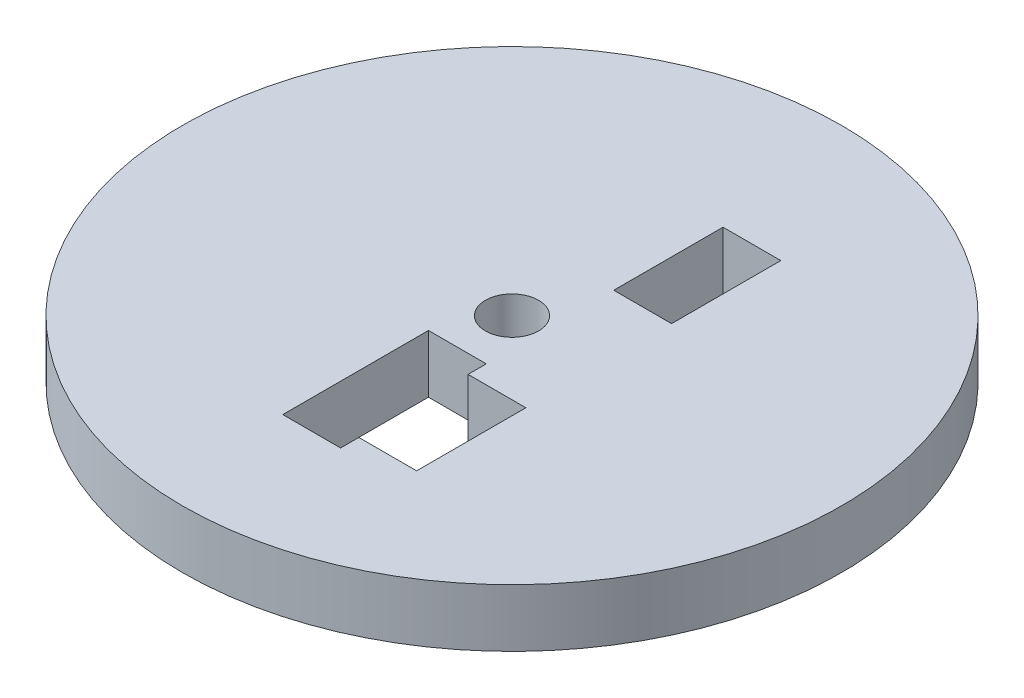
ISO-10303-21;
HEADER;
FILE_DESCRIPTION(('STEP AP214'),'2;1');
FILE_NAME('part.step','',(''),(''),'','','');
FILE_SCHEMA(('AUTOMOTIVE_DESIGN { 1 0 10303 214 1 1 1 1 }'));
ENDSEC;
DATA;
#1=APPLICATION_CONTEXT('core data for automotive mechanical design processes');
#2=APPLICATION_PROTOCOL_DEFINITION('international standard','automotive_design',2000,#1);
#3=PRODUCT_CONTEXT('',#1,'mechanical');
#4=PRODUCT('Part','Part','',(#3));
#5=PRODUCT_RELATED_PRODUCT_CATEGORY('part','',(#4));
#6=PRODUCT_DEFINITION_FORMATION('','',#4);
#7=PRODUCT_DEFINITION_CONTEXT('part definition',#1,'design');
#8=PRODUCT_DEFINITION('design','',#6,#7);
#9=PRODUCT_DEFINITION_SHAPE('','',#8);
#10=(LENGTH_UNIT() NAMED_UNIT(*) SI_UNIT(.MILLI.,.METRE.));
#11=(NAMED_UNIT(*) PLANE_ANGLE_UNIT() SI_UNIT($,.RADIAN.));
#12=(NAMED_UNIT(*) SI_UNIT($,.STERADIAN.) SOLID_ANGLE_UNIT());
#13=UNCERTAINTY_MEASURE_WITH_UNIT(LENGTH_MEASURE(1.E-05),#10,'distance_accuracy_value','');
#14=(GEOMETRIC_REPRESENTATION_CONTEXT(3) GLOBAL_UNCERTAINTY_ASSIGNED_CONTEXT((#13)) GLOBAL_UNIT_ASSIGNED_CONTEXT((#10,
#11,#12)) REPRESENTATION_CONTEXT('',''));
#15=CARTESIAN_POINT('',(0.,0.,0.));
#16=DIRECTION('',(0.,0.,1.));
#17=DIRECTION('',(1.,0.,0.));
#18=AXIS2_PLACEMENT_3D('',#15,#16,#17);
#19=CARTESIAN_POINT('',(0.,3.175,0.));
#20=DIRECTION('',(0.,1.,0.));
#21=DIRECTION('',(0.,0.,1.));
#22=AXIS2_PLACEMENT_3D('',#19,#20,#21);
#23=PLANE('',#22);
#24=DIRECTION('',(1.,0.,0.));
#25=VECTOR('',#24,1.);
#26=CARTESIAN_POINT('',(1.5875,3.175,-4.));
#27=LINE('',#26,#25);
#28=CARTESIAN_POINT('',(1.5875,3.175,-4.));
#29=VERTEX_POINT('',#28);
#30=CARTESIAN_POINT('',(4.7625,3.175,-4.));
#31=VERTEX_POINT('',#30);
#32=EDGE_CURVE('E199',#29,#31,#27,.T.);
#33=ORIENTED_EDGE('',*,*,#32,.F.);
#34=DIRECTION('',(0.,0.,1.));
#35=VECTOR('',#34,1.);
#36=CARTESIAN_POINT('',(1.5875,3.175,-4.));
#37=LINE('',#36,#35);
#38=CARTESIAN_POINT('',(1.5875,3.175,-10.));
#39=VERTEX_POINT('',#38);
#40=EDGE_CURVE('E197',#39,#29,#37,.T.);
#41=ORIENTED_EDGE('',*,*,#40,.F.);
#42=DIRECTION('',(-1.,0.,0.));
#43=VECTOR('',#42,1.);
#44=CARTESIAN_POINT('',(1.5875,3.175,-10.));
#45=LINE('',#44,#43);
#46=CARTESIAN_POINT('',(4.7625,3.175,-10.));
#47=VERTEX_POINT('',#46);
#48=EDGE_CURVE('E205',#47,#39,#45,.T.);
#49=ORIENTED_EDGE('',*,*,#48,.F.);
#50=DIRECTION('',(0.,0.,-1.));
#51=VECTOR('',#50,1.);
#52=CARTESIAN_POINT('',(4.7625,3.175,-4.));
#53=LINE('',#52,#51);
#54=EDGE_CURVE('E202',#31,#47,#53,.T.);
#55=ORIENTED_EDGE('',*,*,#54,.F.);
#56=EDGE_LOOP('',(#33,#41,#49,#55));
#57=FACE_BOUND('',#56,.T.);
#58=CARTESIAN_POINT('',(0.,3.175,0.));
#59=DIRECTION('',(0.,1.,0.));
#60=DIRECTION('',(0.,0.,1.));
#61=AXIS2_PLACEMENT_3D('',#58,#59,#60);
#62=CIRCLE('',#61,18.0975);
#63=CARTESIAN_POINT('',(0.,3.175,18.0975));
#64=VERTEX_POINT('',#63);
#65=EDGE_CURVE('E11',#64,#64,#62,.T.);
#66=ORIENTED_EDGE('',*,*,#65,.T.);
#67=EDGE_LOOP('',(#66));
#68=FACE_BOUND('',#67,.T.);
#69=CARTESIAN_POINT('',(0.,3.175,0.));
#70=DIRECTION('',(0.,1.,0.));
#71=DIRECTION('',(0.,0.,1.));
#72=AXIS2_PLACEMENT_3D('',#69,#70,#71);
#73=CIRCLE('',#72,1.4605);
#74=CARTESIAN_POINT('',(0.,3.175,1.4605));
#75=VERTEX_POINT('',#74);
#76=EDGE_CURVE('E191',#75,#75,#73,.T.);
#77=ORIENTED_EDGE('',*,*,#76,.F.);
#78=EDGE_LOOP('',(#77));
#79=FACE_BOUND('',#78,.T.);
#80=DIRECTION('',(0.,0.,-1.));
#81=VECTOR('',#80,1.);
#82=CARTESIAN_POINT('',(1.5875,3.175,4.));
#83=LINE('',#82,#81);
#84=CARTESIAN_POINT('',(1.5875,3.175,4.));
#85=VERTEX_POINT('',#84);
#86=CARTESIAN_POINT('',(1.5875,3.175,3.));
#87=VERTEX_POINT('',#86);
#88=EDGE_CURVE('E134',#85,#87,#83,.T.);
#89=ORIENTED_EDGE('',*,*,#88,.F.);
#90=DIRECTION('',(-1.,0.,0.));
#91=VECTOR('',#90,1.);
#92=CARTESIAN_POINT('',(1.5875,3.175,4.));
#93=LINE('',#92,#91);
#94=CARTESIAN_POINT('',(4.7625,3.175,4.));
#95=VERTEX_POINT('',#94);
#96=EDGE_CURVE('E126',#95,#85,#93,.T.);
#97=ORIENTED_EDGE('',*,*,#96,.F.);
#98=DIRECTION('',(0.,0.,-1.));
#99=VECTOR('',#98,1.);
#100=CARTESIAN_POINT('',(4.7625,3.175,4.));
#101=LINE('',#100,#99);
#102=CARTESIAN_POINT('',(4.7625,3.175,10.));
#103=VERTEX_POINT('',#102);
#104=EDGE_CURVE('E159',#103,#95,#101,.T.);
#105=ORIENTED_EDGE('',*,*,#104,.F.);
#106=DIRECTION('',(1.,0.,0.));
#107=VECTOR('',#106,1.);
#108=CARTESIAN_POINT('',(1.5875,3.175,10.));
#109=LINE('',#108,#107);
#110=CARTESIAN_POINT('',(1.5875,3.175,10.));
#111=VERTEX_POINT('',#110);
#112=EDGE_CURVE('E157',#111,#103,#109,.T.);
#113=ORIENTED_EDGE('',*,*,#112,.F.);
#114=DIRECTION('',(0.,0.,-1.));
#115=VECTOR('',#114,1.);
#116=CARTESIAN_POINT('',(1.5875,3.175,11.));
#117=LINE('',#116,#115);
#118=CARTESIAN_POINT('',(1.5875,3.175,11.));
#119=VERTEX_POINT('',#118);
#120=EDGE_CURVE('E155',#119,#111,#117,.T.);
#121=ORIENTED_EDGE('',*,*,#120,.F.);
#122=DIRECTION('',(1.,0.,0.));
#123=VECTOR('',#122,1.);
#124=CARTESIAN_POINT('',(-1.5875,3.175,11.));
#125=LINE('',#124,#123);
#126=CARTESIAN_POINT('',(-1.5875,3.175,11.));
#127=VERTEX_POINT('',#126);
#128=EDGE_CURVE('E153',#127,#119,#125,.T.);
#129=ORIENTED_EDGE('',*,*,#128,.F.);
#130=DIRECTION('',(0.,0.,1.));
#131=VECTOR('',#130,1.);
#132=CARTESIAN_POINT('',(-1.5875,3.175,3.));
#133=LINE('',#132,#131);
#134=CARTESIAN_POINT('',(-1.5875,3.175,3.));
#135=VERTEX_POINT('',#134);
#136=EDGE_CURVE('E149',#135,#127,#133,.T.);
#137=ORIENTED_EDGE('',*,*,#136,.F.);
#138=DIRECTION('',(-1.,0.,0.));
#139=VECTOR('',#138,1.);
#140=CARTESIAN_POINT('',(-1.5875,3.175,3.));
#141=LINE('',#140,#139);
#142=EDGE_CURVE('E147',#87,#135,#141,.T.);
#143=ORIENTED_EDGE('',*,*,#142,.F.);
#144=EDGE_LOOP('',(#89,#97,#105,#113,#121,#129,#137,#143));
#145=FACE_BOUND('',#144,.T.);
#146=ADVANCED_FACE('F37',(#57,#68,#79,#145),#23,.T.);
#147=CARTESIAN_POINT('',(0.,0.,0.));
#148=DIRECTION('',(0.,1.,0.));
#149=DIRECTION('',(0.,0.,1.));
#150=AXIS2_PLACEMENT_3D('',#147,#148,#149);
#151=PLANE('',#150);
#152=CARTESIAN_POINT('',(0.,0.,0.));
#153=DIRECTION('',(0.,1.,0.));
#154=DIRECTION('',(0.,0.,1.));
#155=AXIS2_PLACEMENT_3D('',#152,#153,#154);
#156=CIRCLE('',#155,1.4605);
#157=CARTESIAN_POINT('',(0.,0.,1.4605));
#158=VERTEX_POINT('',#157);
#159=EDGE_CURVE('E142',#158,#158,#156,.T.);
#160=ORIENTED_EDGE('',*,*,#159,.T.);
#161=EDGE_LOOP('',(#160));
#162=FACE_BOUND('',#161,.T.);
#163=DIRECTION('',(0.,0.,1.));
#164=VECTOR('',#163,1.);
#165=CARTESIAN_POINT('',(1.5875,0.,-4.));
#166=LINE('',#165,#164);
#167=CARTESIAN_POINT('',(1.5875,0.,-10.));
#168=VERTEX_POINT('',#167);
#169=CARTESIAN_POINT('',(1.5875,0.,-4.));
#170=VERTEX_POINT('',#169);
#171=EDGE_CURVE('E194',#168,#170,#166,.T.);
#172=ORIENTED_EDGE('',*,*,#171,.T.);
#173=DIRECTION('',(1.,0.,0.));
#174=VECTOR('',#173,1.);
#175=CARTESIAN_POINT('',(1.5875,0.,-4.));
#176=LINE('',#175,#174);
#177=CARTESIAN_POINT('',(4.7625,0.,-4.));
#178=VERTEX_POINT('',#177);
#179=EDGE_CURVE('E210',#170,#178,#176,.T.);
#180=ORIENTED_EDGE('',*,*,#179,.T.);
#181=DIRECTION('',(0.,0.,-1.));
#182=VECTOR('',#181,1.);
#183=CARTESIAN_POINT('',(4.7625,0.,-4.));
#184=LINE('',#183,#182);
#185=CARTESIAN_POINT('',(4.7625,0.,-10.));
#186=VERTEX_POINT('',#185);
#187=EDGE_CURVE('E213',#178,#186,#184,.T.);
#188=ORIENTED_EDGE('',*,*,#187,.T.);
#189=DIRECTION('',(-1.,0.,0.));
#190=VECTOR('',#189,1.);
#191=CARTESIAN_POINT('',(1.5875,0.,-10.));
#192=LINE('',#191,#190);
#193=EDGE_CURVE('E200',#186,#168,#192,.T.);
#194=ORIENTED_EDGE('',*,*,#193,.T.);
#195=EDGE_LOOP('',(#172,#180,#188,#194));
#196=FACE_BOUND('',#195,.T.);
#197=CARTESIAN_POINT('',(0.,0.,0.));
#198=DIRECTION('',(0.,1.,0.));
#199=DIRECTION('',(0.,0.,1.));
#200=AXIS2_PLACEMENT_3D('',#197,#198,#199);
#201=CIRCLE('',#200,18.0975);
#202=CARTESIAN_POINT('',(0.,0.,18.0975));
#203=VERTEX_POINT('',#202);
#204=EDGE_CURVE('E41',#203,#203,#201,.T.);
#205=ORIENTED_EDGE('',*,*,#204,.F.);
#206=EDGE_LOOP('',(#205));
#207=FACE_BOUND('',#206,.T.);
#208=DIRECTION('',(-1.,0.,0.));
#209=VECTOR('',#208,1.);
#210=CARTESIAN_POINT('',(1.5875,0.,4.));
#211=LINE('',#210,#209);
#212=CARTESIAN_POINT('',(4.7625,0.,4.));
#213=VERTEX_POINT('',#212);
#214=CARTESIAN_POINT('',(1.5875,0.,4.));
#215=VERTEX_POINT('',#214);
#216=EDGE_CURVE('E60',#213,#215,#211,.T.);
#217=ORIENTED_EDGE('',*,*,#216,.T.);
#218=DIRECTION('',(0.,0.,-1.));
#219=VECTOR('',#218,1.);
#220=CARTESIAN_POINT('',(1.5875,0.,4.));
#221=LINE('',#220,#219);
#222=CARTESIAN_POINT('',(1.5875,0.,3.));
#223=VERTEX_POINT('',#222);
#224=EDGE_CURVE('E141',#215,#223,#221,.T.);
#225=ORIENTED_EDGE('',*,*,#224,.T.);
#226=DIRECTION('',(-1.,0.,0.));
#227=VECTOR('',#226,1.);
#228=CARTESIAN_POINT('',(-1.5875,0.,3.));
#229=LINE('',#228,#227);
#230=CARTESIAN_POINT('',(-1.5875,0.,3.));
#231=VERTEX_POINT('',#230);
#232=EDGE_CURVE('E163',#223,#231,#229,.T.);
#233=ORIENTED_EDGE('',*,*,#232,.T.);
#234=DIRECTION('',(0.,0.,1.));
#235=VECTOR('',#234,1.);
#236=CARTESIAN_POINT('',(-1.5875,0.,3.));
#237=LINE('',#236,#235);
#238=CARTESIAN_POINT('',(-1.5875,0.,11.));
#239=VERTEX_POINT('',#238);
#240=EDGE_CURVE('E166',#231,#239,#237,.T.);
#241=ORIENTED_EDGE('',*,*,#240,.T.);
#242=DIRECTION('',(1.,0.,0.));
#243=VECTOR('',#242,1.);
#244=CARTESIAN_POINT('',(-1.5875,0.,11.));
#245=LINE('',#244,#243);
#246=CARTESIAN_POINT('',(1.5875,0.,11.));
#247=VERTEX_POINT('',#246);
#248=EDGE_CURVE('E169',#239,#247,#245,.T.);
#249=ORIENTED_EDGE('',*,*,#248,.T.);
#250=DIRECTION('',(0.,0.,-1.));
#251=VECTOR('',#250,1.);
#252=CARTESIAN_POINT('',(1.5875,0.,11.));
#253=LINE('',#252,#251);
#254=CARTESIAN_POINT('',(1.5875,0.,10.));
#255=VERTEX_POINT('',#254);
#256=EDGE_CURVE('E172',#247,#255,#253,.T.);
#257=ORIENTED_EDGE('',*,*,#256,.T.);
#258=DIRECTION('',(1.,0.,0.));
#259=VECTOR('',#258,1.);
#260=CARTESIAN_POINT('',(1.5875,0.,10.));
#261=LINE('',#260,#259);
#262=CARTESIAN_POINT('',(4.7625,0.,10.));
#263=VERTEX_POINT('',#262);
#264=EDGE_CURVE('E175',#255,#263,#261,.T.);
#265=ORIENTED_EDGE('',*,*,#264,.T.);
#266=DIRECTION('',(0.,0.,-1.));
#267=VECTOR('',#266,1.);
#268=CARTESIAN_POINT('',(4.7625,0.,4.));
#269=LINE('',#268,#267);
#270=EDGE_CURVE('E135',#263,#213,#269,.T.);
#271=ORIENTED_EDGE('',*,*,#270,.T.);
#272=EDGE_LOOP('',(#217,#225,#233,#241,#249,#257,#265,#271));
#273=FACE_BOUND('',#272,.T.);
#274=ADVANCED_FACE('F232',(#162,#196,#207,#273),#151,.F.);
#275=CARTESIAN_POINT('',(0.,3.175,0.));
#276=DIRECTION('',(0.,-1.,0.));
#277=DIRECTION('',(0.,0.,-1.));
#278=AXIS2_PLACEMENT_3D('',#275,#276,#277);
#279=CYLINDRICAL_SURFACE('',#278,18.0975);
#280=ORIENTED_EDGE('',*,*,#65,.F.);
#281=EDGE_LOOP('',(#280));
#282=FACE_BOUND('',#281,.T.);
#283=ORIENTED_EDGE('',*,*,#204,.T.);
#284=EDGE_LOOP('',(#283));
#285=FACE_BOUND('',#284,.T.);
#286=ADVANCED_FACE('F39',(#282,#285),#279,.T.);
#287=CARTESIAN_POINT('',(1.5875,3.175,-4.));
#288=DIRECTION('',(1.,0.,0.));
#289=DIRECTION('',(0.,0.,-1.));
#290=AXIS2_PLACEMENT_3D('',#287,#288,#289);
#291=PLANE('',#290);
#292=ORIENTED_EDGE('',*,*,#171,.F.);
#293=DIRECTION('',(0.,-1.,0.));
#294=VECTOR('',#293,1.);
#295=CARTESIAN_POINT('',(1.5875,3.175,-10.));
#296=LINE('',#295,#294);
#297=EDGE_CURVE('E207',#39,#168,#296,.T.);
#298=ORIENTED_EDGE('',*,*,#297,.F.);
#299=ORIENTED_EDGE('',*,*,#40,.T.);
#300=DIRECTION('',(0.,-1.,0.));
#301=VECTOR('',#300,1.);
#302=CARTESIAN_POINT('',(1.5875,3.175,-4.));
#303=LINE('',#302,#301);
#304=EDGE_CURVE('E224',#29,#170,#303,.T.);
#305=ORIENTED_EDGE('',*,*,#304,.T.);
#306=EDGE_LOOP('',(#292,#298,#299,#305));
#307=FACE_BOUND('',#306,.T.);
#308=ADVANCED_FACE('F275',(#307),#291,.T.);
#309=CARTESIAN_POINT('',(1.5875,3.175,-4.));
#310=DIRECTION('',(0.,0.,-1.));
#311=DIRECTION('',(-1.,0.,0.));
#312=AXIS2_PLACEMENT_3D('',#309,#310,#311);
#313=PLANE('',#312);
#314=ORIENTED_EDGE('',*,*,#179,.F.);
#315=ORIENTED_EDGE('',*,*,#304,.F.);
#316=ORIENTED_EDGE('',*,*,#32,.T.);
#317=DIRECTION('',(0.,-1.,0.));
#318=VECTOR('',#317,1.);
#319=CARTESIAN_POINT('',(4.7625,3.175,-4.));
#320=LINE('',#319,#318);
#321=EDGE_CURVE('E222',#31,#178,#320,.T.);
#322=ORIENTED_EDGE('',*,*,#321,.T.);
#323=EDGE_LOOP('',(#314,#315,#316,#322));
#324=FACE_BOUND('',#323,.T.);
#325=ADVANCED_FACE('F278',(#324),#313,.T.);
#326=CARTESIAN_POINT('',(4.7625,3.175,-4.));
#327=DIRECTION('',(-1.,0.,0.));
#328=DIRECTION('',(0.,0.,1.));
#329=AXIS2_PLACEMENT_3D('',#326,#327,#328);
#330=PLANE('',#329);
#331=ORIENTED_EDGE('',*,*,#187,.F.);
#332=ORIENTED_EDGE('',*,*,#321,.F.);
#333=ORIENTED_EDGE('',*,*,#54,.T.);
#334=DIRECTION('',(0.,-1.,0.));
#335=VECTOR('',#334,1.);
#336=CARTESIAN_POINT('',(4.7625,3.175,-10.));
#337=LINE('',#336,#335);
#338=EDGE_CURVE('E220',#47,#186,#337,.T.);
#339=ORIENTED_EDGE('',*,*,#338,.T.);
#340=EDGE_LOOP('',(#331,#332,#333,#339));
#341=FACE_BOUND('',#340,.T.);
#342=ADVANCED_FACE('F281',(#341),#330,.T.);
#343=CARTESIAN_POINT('',(1.5875,3.175,-10.));
#344=DIRECTION('',(0.,0.,1.));
#345=DIRECTION('',(1.,0.,0.));
#346=AXIS2_PLACEMENT_3D('',#343,#344,#345);
#347=PLANE('',#346);
#348=ORIENTED_EDGE('',*,*,#193,.F.);
#349=ORIENTED_EDGE('',*,*,#338,.F.);
#350=ORIENTED_EDGE('',*,*,#48,.T.);
#351=ORIENTED_EDGE('',*,*,#297,.T.);
#352=EDGE_LOOP('',(#348,#349,#350,#351));
#353=FACE_BOUND('',#352,.T.);
#354=ADVANCED_FACE('F285',(#353),#347,.T.);
#355=CARTESIAN_POINT('',(0.,3.175,0.));
#356=DIRECTION('',(0.,-1.,0.));
#357=DIRECTION('',(0.,0.,-1.));
#358=AXIS2_PLACEMENT_3D('',#355,#356,#357);
#359=CYLINDRICAL_SURFACE('',#358,1.4605);
#360=ORIENTED_EDGE('',*,*,#76,.T.);
#361=EDGE_LOOP('',(#360));
#362=FACE_BOUND('',#361,.T.);
#363=ORIENTED_EDGE('',*,*,#159,.F.);
#364=EDGE_LOOP('',(#363));
#365=FACE_BOUND('',#364,.T.);
#366=ADVANCED_FACE('F289',(#362,#365),#359,.F.);
#367=CARTESIAN_POINT('',(1.5875,3.175,4.));
#368=DIRECTION('',(0.,0.,1.));
#369=DIRECTION('',(1.,0.,0.));
#370=AXIS2_PLACEMENT_3D('',#367,#368,#369);
#371=PLANE('',#370);
#372=ORIENTED_EDGE('',*,*,#216,.F.);
#373=DIRECTION('',(0.,-1.,0.));
#374=VECTOR('',#373,1.);
#375=CARTESIAN_POINT('',(4.7625,3.175,4.));
#376=LINE('',#375,#374);
#377=EDGE_CURVE('E130',#95,#213,#376,.T.);
#378=ORIENTED_EDGE('',*,*,#377,.F.);
#379=ORIENTED_EDGE('',*,*,#96,.T.);
#380=DIRECTION('',(0.,-1.,0.));
#381=VECTOR('',#380,1.);
#382=CARTESIAN_POINT('',(1.5875,3.175,4.));
#383=LINE('',#382,#381);
#384=EDGE_CURVE('E129',#85,#215,#383,.T.);
#385=ORIENTED_EDGE('',*,*,#384,.T.);
#386=EDGE_LOOP('',(#372,#378,#379,#385));
#387=FACE_BOUND('',#386,.T.);
#388=ADVANCED_FACE('F128',(#387),#371,.T.);
#389=CARTESIAN_POINT('',(1.5875,3.175,4.));
#390=DIRECTION('',(-1.,0.,0.));
#391=DIRECTION('',(0.,0.,1.));
#392=AXIS2_PLACEMENT_3D('',#389,#390,#391);
#393=PLANE('',#392);
#394=ORIENTED_EDGE('',*,*,#224,.F.);
#395=ORIENTED_EDGE('',*,*,#384,.F.);
#396=ORIENTED_EDGE('',*,*,#88,.T.);
#397=DIRECTION('',(0.,-1.,0.));
#398=VECTOR('',#397,1.);
#399=CARTESIAN_POINT('',(1.5875,3.175,3.));
#400=LINE('',#399,#398);
#401=EDGE_CURVE('E143',#87,#223,#400,.T.);
#402=ORIENTED_EDGE('',*,*,#401,.T.);
#403=EDGE_LOOP('',(#394,#395,#396,#402));
#404=FACE_BOUND('',#403,.T.);
#405=ADVANCED_FACE('F138',(#404),#393,.T.);
#406=CARTESIAN_POINT('',(-1.5875,3.175,3.));
#407=DIRECTION('',(0.,0.,1.));
#408=DIRECTION('',(1.,0.,0.));
#409=AXIS2_PLACEMENT_3D('',#406,#407,#408);
#410=PLANE('',#409);
#411=ORIENTED_EDGE('',*,*,#232,.F.);
#412=ORIENTED_EDGE('',*,*,#401,.F.);
#413=ORIENTED_EDGE('',*,*,#142,.T.);
#414=DIRECTION('',(0.,-1.,0.));
#415=VECTOR('',#414,1.);
#416=CARTESIAN_POINT('',(-1.5875,3.175,3.));
#417=LINE('',#416,#415);
#418=EDGE_CURVE('E188',#135,#231,#417,.T.);
#419=ORIENTED_EDGE('',*,*,#418,.T.);
#420=EDGE_LOOP('',(#411,#412,#413,#419));
#421=FACE_BOUND('',#420,.T.);
#422=ADVANCED_FACE('F258',(#421),#410,.T.);
#423=CARTESIAN_POINT('',(-1.5875,3.175,3.));
#424=DIRECTION('',(1.,0.,0.));
#425=DIRECTION('',(0.,0.,-1.));
#426=AXIS2_PLACEMENT_3D('',#423,#424,#425);
#427=PLANE('',#426);
#428=ORIENTED_EDGE('',*,*,#240,.F.);
#429=ORIENTED_EDGE('',*,*,#418,.F.);
#430=ORIENTED_EDGE('',*,*,#136,.T.);
#431=DIRECTION('',(0.,-1.,0.));
#432=VECTOR('',#431,1.);
#433=CARTESIAN_POINT('',(-1.5875,3.175,11.));
#434=LINE('',#433,#432);
#435=EDGE_CURVE('E186',#127,#239,#434,.T.);
#436=ORIENTED_EDGE('',*,*,#435,.T.);
#437=EDGE_LOOP('',(#428,#429,#430,#436));
#438=FACE_BOUND('',#437,.T.);
#439=ADVANCED_FACE('F255',(#438),#427,.T.);
#440=CARTESIAN_POINT('',(-1.5875,3.175,11.));
#441=DIRECTION('',(0.,0.,-1.));
#442=DIRECTION('',(-1.,0.,0.));
#443=AXIS2_PLACEMENT_3D('',#440,#441,#442);
#444=PLANE('',#443);
#445=ORIENTED_EDGE('',*,*,#248,.F.);
#446=ORIENTED_EDGE('',*,*,#435,.F.);
#447=ORIENTED_EDGE('',*,*,#128,.T.);
#448=DIRECTION('',(0.,-1.,0.));
#449=VECTOR('',#448,1.);
#450=CARTESIAN_POINT('',(1.5875,3.175,11.));
#451=LINE('',#450,#449);
#452=EDGE_CURVE('E184',#119,#247,#451,.T.);
#453=ORIENTED_EDGE('',*,*,#452,.T.);
#454=EDGE_LOOP('',(#445,#446,#447,#453));
#455=FACE_BOUND('',#454,.T.);
#456=ADVANCED_FACE('F250',(#455),#444,.T.);
#457=CARTESIAN_POINT('',(1.5875,3.175,11.));
#458=DIRECTION('',(-1.,0.,0.));
#459=DIRECTION('',(0.,0.,1.));
#460=AXIS2_PLACEMENT_3D('',#457,#458,#459);
#461=PLANE('',#460);
#462=ORIENTED_EDGE('',*,*,#256,.F.);
#463=ORIENTED_EDGE('',*,*,#452,.F.);
#464=ORIENTED_EDGE('',*,*,#120,.T.);
#465=DIRECTION('',(0.,-1.,0.));
#466=VECTOR('',#465,1.);
#467=CARTESIAN_POINT('',(1.5875,3.175,10.));
#468=LINE('',#467,#466);
#469=EDGE_CURVE('E182',#111,#255,#468,.T.);
#470=ORIENTED_EDGE('',*,*,#469,.T.);
#471=EDGE_LOOP('',(#462,#463,#464,#470));
#472=FACE_BOUND('',#471,.T.);
#473=ADVANCED_FACE('F246',(#472),#461,.T.);
#474=CARTESIAN_POINT('',(1.5875,3.175,10.));
#475=DIRECTION('',(0.,0.,-1.));
#476=DIRECTION('',(-1.,0.,0.));
#477=AXIS2_PLACEMENT_3D('',#474,#475,#476);
#478=PLANE('',#477);
#479=ORIENTED_EDGE('',*,*,#264,.F.);
#480=ORIENTED_EDGE('',*,*,#469,.F.);
#481=ORIENTED_EDGE('',*,*,#112,.T.);
#482=DIRECTION('',(0.,-1.,0.));
#483=VECTOR('',#482,1.);
#484=CARTESIAN_POINT('',(4.7625,3.175,10.));
#485=LINE('',#484,#483);
#486=EDGE_CURVE('E52',#103,#263,#485,.T.);
#487=ORIENTED_EDGE('',*,*,#486,.T.);
#488=EDGE_LOOP('',(#479,#480,#481,#487));
#489=FACE_BOUND('',#488,.T.);
#490=ADVANCED_FACE('F243',(#489),#478,.T.);
#491=CARTESIAN_POINT('',(4.7625,3.175,4.));
#492=DIRECTION('',(-1.,0.,0.));
#493=DIRECTION('',(0.,0.,1.));
#494=AXIS2_PLACEMENT_3D('',#491,#492,#493);
#495=PLANE('',#494);
#496=ORIENTED_EDGE('',*,*,#270,.F.);
#497=ORIENTED_EDGE('',*,*,#486,.F.);
#498=ORIENTED_EDGE('',*,*,#104,.T.);
#499=ORIENTED_EDGE('',*,*,#377,.T.);
#500=EDGE_LOOP('',(#496,#497,#498,#499));
#501=FACE_BOUND('',#500,.T.);
#502=ADVANCED_FACE('F237',(#501),#495,.T.);
#503=CLOSED_SHELL('',(#146,#274,#286,#308,#325,#342,#354,#366,#388,#405,#422,#439,#456,#473,
#490,#502));
#504=MANIFOLD_SOLID_BREP('B2',#503);
#505=ADVANCED_BREP_SHAPE_REPRESENTATION('',(#18,#504),#14);
#506=SHAPE_DEFINITION_REPRESENTATION(#9,#505);
ENDSEC;
END-ISO-10303-21;
